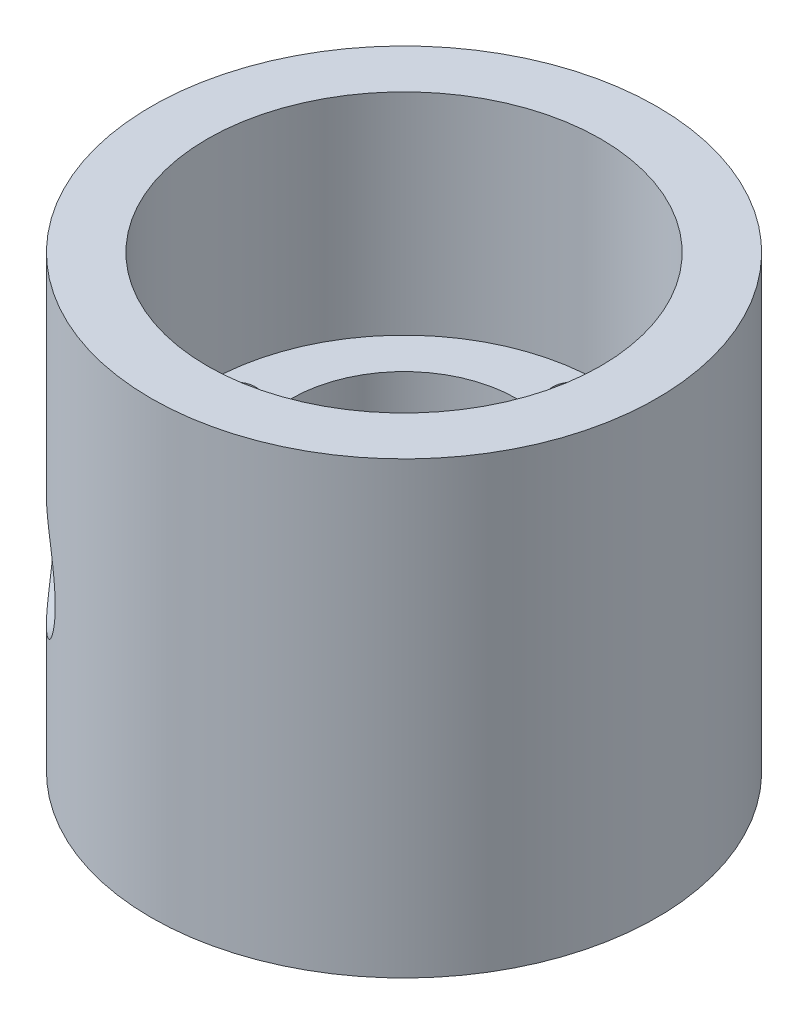
ISO-10303-21;
HEADER;
FILE_DESCRIPTION(('STEP AP214'),'2;1');
FILE_NAME('part.step','',(''),(''),'','','');
FILE_SCHEMA(('AUTOMOTIVE_DESIGN { 1 0 10303 214 1 1 1 1 }'));
ENDSEC;
DATA;
#1=APPLICATION_CONTEXT('core data for automotive mechanical design processes');
#2=APPLICATION_PROTOCOL_DEFINITION('international standard','automotive_design',2000,#1);
#3=PRODUCT_CONTEXT('',#1,'mechanical');
#4=PRODUCT('Part','Part','',(#3));
#5=PRODUCT_RELATED_PRODUCT_CATEGORY('part','',(#4));
#6=PRODUCT_DEFINITION_FORMATION('','',#4);
#7=PRODUCT_DEFINITION_CONTEXT('part definition',#1,'design');
#8=PRODUCT_DEFINITION('design','',#6,#7);
#9=PRODUCT_DEFINITION_SHAPE('','',#8);
#10=(LENGTH_UNIT() NAMED_UNIT(*) SI_UNIT(.MILLI.,.METRE.));
#11=(NAMED_UNIT(*) PLANE_ANGLE_UNIT() SI_UNIT($,.RADIAN.));
#12=(NAMED_UNIT(*) SI_UNIT($,.STERADIAN.) SOLID_ANGLE_UNIT());
#13=UNCERTAINTY_MEASURE_WITH_UNIT(LENGTH_MEASURE(1.E-05),#10,'distance_accuracy_value','');
#14=(GEOMETRIC_REPRESENTATION_CONTEXT(3) GLOBAL_UNCERTAINTY_ASSIGNED_CONTEXT((#13)) GLOBAL_UNIT_ASSIGNED_CONTEXT((#10,
#11,#12)) REPRESENTATION_CONTEXT('',''));
#15=CARTESIAN_POINT('',(0.,0.,0.));
#16=DIRECTION('',(0.,0.,1.));
#17=DIRECTION('',(1.,0.,0.));
#18=AXIS2_PLACEMENT_3D('',#15,#16,#17);
#19=CARTESIAN_POINT('',(1.5875,7.14375,1.5875));
#20=DIRECTION('',(0.,1.,0.));
#21=DIRECTION('',(0.,0.,1.));
#22=AXIS2_PLACEMENT_3D('',#19,#20,#21);
#23=CYLINDRICAL_SURFACE('',#22,6.35);
#24=CARTESIAN_POINT('',(1.5875,13.49375,1.5875));
#25=DIRECTION('',(0.,1.,0.));
#26=DIRECTION('',(0.,0.,1.));
#27=AXIS2_PLACEMENT_3D('',#24,#25,#26);
#28=CIRCLE('',#27,6.35);
#29=CARTESIAN_POINT('',(7.9375,13.49375,1.5875));
#30=VERTEX_POINT('',#29);
#31=CARTESIAN_POINT('',(1.5875,13.49375,7.9375));
#32=VERTEX_POINT('',#31);
#33=EDGE_CURVE('E102',#30,#32,#28,.F.);
#34=ORIENTED_EDGE('',*,*,#33,.F.);
#35=DIRECTION('',(0.,1.,0.));
#36=VECTOR('',#35,1.);
#37=CARTESIAN_POINT('',(7.9375,7.14375,1.5875));
#38=LINE('',#37,#36);
#39=CARTESIAN_POINT('',(7.9375,7.14375,1.5875));
#40=VERTEX_POINT('',#39);
#41=EDGE_CURVE('E109',#40,#30,#38,.T.);
#42=ORIENTED_EDGE('',*,*,#41,.F.);
#43=CARTESIAN_POINT('',(1.5875,7.14375,1.5875));
#44=DIRECTION('',(0.,1.,0.));
#45=DIRECTION('',(0.,0.,1.));
#46=AXIS2_PLACEMENT_3D('',#43,#44,#45);
#47=CIRCLE('',#46,6.35);
#48=CARTESIAN_POINT('',(1.5875,7.14375,7.9375));
#49=VERTEX_POINT('',#48);
#50=EDGE_CURVE('E112',#49,#40,#47,.T.);
#51=ORIENTED_EDGE('',*,*,#50,.F.);
#52=DIRECTION('',(0.,1.,0.));
#53=VECTOR('',#52,1.);
#54=CARTESIAN_POINT('',(1.5875,7.14375,7.9375));
#55=LINE('',#54,#53);
#56=EDGE_CURVE('E111',#49,#32,#55,.T.);
#57=ORIENTED_EDGE('',*,*,#56,.T.);
#58=EDGE_LOOP('',(#34,#42,#51,#57));
#59=FACE_BOUND('',#58,.T.);
#60=ADVANCED_FACE('F33',(#59),#23,.F.);
#61=CARTESIAN_POINT('',(-1.5875,7.14375,7.9375));
#62=DIRECTION('',(0.,0.,1.));
#63=DIRECTION('',(1.,0.,0.));
#64=AXIS2_PLACEMENT_3D('',#61,#62,#63);
#65=PLANE('',#64);
#66=DIRECTION('',(-1.,0.,0.));
#67=VECTOR('',#66,1.);
#68=CARTESIAN_POINT('',(-1.5875,13.49375,7.9375));
#69=LINE('',#68,#67);
#70=CARTESIAN_POINT('',(-1.5875,13.49375,7.9375));
#71=VERTEX_POINT('',#70);
#72=EDGE_CURVE('E113',#32,#71,#69,.T.);
#73=ORIENTED_EDGE('',*,*,#72,.F.);
#74=ORIENTED_EDGE('',*,*,#56,.F.);
#75=DIRECTION('',(1.,0.,0.));
#76=VECTOR('',#75,1.);
#77=CARTESIAN_POINT('',(-1.5875,7.14375,7.9375));
#78=LINE('',#77,#76);
#79=CARTESIAN_POINT('',(-1.5875,7.14375,7.9375));
#80=VERTEX_POINT('',#79);
#81=EDGE_CURVE('E120',#80,#49,#78,.T.);
#82=ORIENTED_EDGE('',*,*,#81,.F.);
#83=DIRECTION('',(0.,1.,0.));
#84=VECTOR('',#83,1.);
#85=CARTESIAN_POINT('',(-1.5875,7.14375,7.9375));
#86=LINE('',#85,#84);
#87=EDGE_CURVE('E214',#80,#71,#86,.T.);
#88=ORIENTED_EDGE('',*,*,#87,.T.);
#89=EDGE_LOOP('',(#73,#74,#82,#88));
#90=FACE_BOUND('',#89,.T.);
#91=ADVANCED_FACE('F158',(#90),#65,.F.);
#92=CARTESIAN_POINT('',(-1.5875,7.14375,1.5875));
#93=DIRECTION('',(0.,1.,0.));
#94=DIRECTION('',(0.,0.,1.));
#95=AXIS2_PLACEMENT_3D('',#92,#93,#94);
#96=CYLINDRICAL_SURFACE('',#95,6.35);
#97=CARTESIAN_POINT('',(-7.71348283393119,10.31875,3.25927579788091));
#98=CARTESIAN_POINT('',(-7.71348288630265,10.236548358768,3.25927723208728));
#99=CARTESIAN_POINT('',(-7.71250840108402,10.1543354461208,3.26286175721447));
#100=CARTESIAN_POINT('',(-7.70859263490347,9.99056091025765,3.27710620859846));
#101=CARTESIAN_POINT('',(-7.70565041848656,9.90899961549045,3.28776950006702));
#102=CARTESIAN_POINT('',(-7.69378214175024,9.66600471366821,3.33012635310995));
#103=CARTESIAN_POINT('',(-7.68181428556403,9.50640923927025,3.3721863292724));
#104=CARTESIAN_POINT('',(-7.64909475070211,9.19768423465855,3.4802959986888));
#105=CARTESIAN_POINT('',(-7.62838911216833,9.0485045568122,3.54621969663539));
#106=CARTESIAN_POINT('',(-7.57706767047033,8.76254132316634,3.6979460164086));
#107=CARTESIAN_POINT('',(-7.54645146794435,8.62575826719254,3.78374943928035));
#108=CARTESIAN_POINT('',(-7.47105353104531,8.35626305207354,3.97874859086851));
#109=CARTESIAN_POINT('',(-7.42532441198186,8.22478049162882,4.08927701558775));
#110=CARTESIAN_POINT('',(-7.31908326896584,7.98125636433913,4.32392934910468));
#111=CARTESIAN_POINT('',(-7.25856400578982,7.86922436388671,4.44805989917282));
#112=CARTESIAN_POINT('',(-7.11683757639493,7.66054334134762,4.71368315526549));
#113=CARTESIAN_POINT('',(-7.03452770270039,7.56539981283008,4.8557811216406));
#114=CARTESIAN_POINT('',(-6.85089760808282,7.40371734539538,5.14393790263186));
#115=CARTESIAN_POINT('',(-6.74958925350935,7.33716063622559,5.2899941964451));
#116=CARTESIAN_POINT('',(-6.53676723380618,7.23938776322082,5.56944676144378));
#117=CARTESIAN_POINT('',(-6.42646940270325,7.20601850675575,5.70301194048007));
#118=CARTESIAN_POINT('',(-6.19297094503589,7.16848366269772,5.96272104295744));
#119=CARTESIAN_POINT('',(-6.06977802741331,7.16430072700139,6.08886933070963));
#120=CARTESIAN_POINT('',(-5.82562125092652,7.18441122772869,6.31894443120551));
#121=CARTESIAN_POINT('',(-5.70536941091144,7.20629751961182,6.42384907316836));
#122=CARTESIAN_POINT('',(-5.46144291063261,7.27362648384906,6.62135537355313));
#123=CARTESIAN_POINT('',(-5.33776799522209,7.31907091666347,6.71395611187521));
#124=CARTESIAN_POINT('',(-5.08931690145904,7.43253937304063,6.88684216795603));
#125=CARTESIAN_POINT('',(-4.96454955515729,7.5008706889931,6.96693686044757));
#126=CARTESIAN_POINT('',(-4.71964088227218,7.65775491603314,7.11312801199449));
#127=CARTESIAN_POINT('',(-4.59950123839695,7.74631510304895,7.17921941781483));
#128=CARTESIAN_POINT('',(-4.35677647311003,7.95066296951351,7.30360864726293));
#129=CARTESIAN_POINT('',(-4.23501116476936,8.06822123029375,7.36060182144063));
#130=CARTESIAN_POINT('',(-4.00629443600086,8.32243953478651,7.46010758737054));
#131=CARTESIAN_POINT('',(-3.89935411578425,8.45911373938668,7.50260936306772));
#132=CARTESIAN_POINT('',(-3.69935216320274,8.75819486648312,7.57704799248509));
#133=CARTESIAN_POINT('',(-3.60755511683256,8.92166957389691,7.60817051309024));
#134=CARTESIAN_POINT('',(-3.49163756473933,9.17785056959237,7.64542073000237));
#135=CARTESIAN_POINT('',(-3.45662302968608,9.26509169529373,7.65626648342722));
#136=CARTESIAN_POINT('',(-3.39458116523898,9.44265558981677,7.67502911672624));
#137=CARTESIAN_POINT('',(-3.36754894927096,9.53297643537399,7.68294778923625));
#138=CARTESIAN_POINT('',(-3.32392135306818,9.70878809149197,7.69551237631457));
#139=CARTESIAN_POINT('',(-3.30667420522056,9.79410290353244,7.70036609595561));
#140=CARTESIAN_POINT('',(-3.27993896104936,9.96599931967349,7.70782218872443));
#141=CARTESIAN_POINT('',(-3.27044686114184,10.0525802466052,7.71042572356208));
#142=CARTESIAN_POINT('',(-3.25945350147406,10.2262619841196,7.71343722590599));
#143=CARTESIAN_POINT('',(-3.25794942539165,10.3133626006318,7.71384596722693));
#144=CARTESIAN_POINT('',(-3.26294978569848,10.4872891647341,7.71247879684957));
#145=CARTESIAN_POINT('',(-3.2694537018229,10.5741151298003,7.71070302707504));
#146=CARTESIAN_POINT('',(-3.29854748323687,10.814548624092,7.70266567609911));
#147=CARTESIAN_POINT('',(-3.32975354521154,10.9671155118767,7.69397798857677));
#148=CARTESIAN_POINT('',(-3.41497282834417,11.2649700782059,7.6690100982807));
#149=CARTESIAN_POINT('',(-3.4689932890754,11.4102554297538,7.65272748527773));
#150=CARTESIAN_POINT('',(-3.59944800016004,11.6972074671456,7.61074318044029));
#151=CARTESIAN_POINT('',(-3.67680570989392,11.8383936858082,7.58463960667301));
#152=CARTESIAN_POINT('',(-3.84876387574014,12.1072900059462,7.52193800375341));
#153=CARTESIAN_POINT('',(-3.94337316520988,12.2349931505207,7.48533459282221));
#154=CARTESIAN_POINT('',(-4.15849936697145,12.4898238638528,7.39505331544703));
#155=CARTESIAN_POINT('',(-4.28077323340074,12.6149279151827,7.33982387062913));
#156=CARTESIAN_POINT('',(-4.53697342987112,12.8429188473807,7.21275979658113));
#157=CARTESIAN_POINT('',(-4.67090347891483,12.9457986006744,7.14091985543189));
#158=CARTESIAN_POINT('',(-4.94853215707208,13.1285515667187,6.97753768879035));
#159=CARTESIAN_POINT('',(-5.09239071290376,13.207790597739,6.88555083338806));
#160=CARTESIAN_POINT('',(-5.38054801250668,13.3363065082814,6.68320164306115));
#161=CARTESIAN_POINT('',(-5.5248462670163,13.3856092830108,6.57285529489284));
#162=CARTESIAN_POINT('',(-5.79465381594438,13.4486665874728,6.34675309292175));
#163=CARTESIAN_POINT('',(-5.92067937069309,13.4652427372141,6.23239849723771));
#164=CARTESIAN_POINT('',(-6.16332958146822,13.4706577023946,5.99354396838973));
#165=CARTESIAN_POINT('',(-6.27995740827275,13.4595059139934,5.86904748583326));
#166=CARTESIAN_POINT('',(-6.49325020616646,13.411666704053,5.62247341274974));
#167=CARTESIAN_POINT('',(-6.59071599713175,13.3766641066732,5.50075339389313));
#168=CARTESIAN_POINT('',(-6.77273670137609,13.2843648144406,5.25616137850517));
#169=CARTESIAN_POINT('',(-6.85728973215191,13.2270648732531,5.13328921677333));
#170=CARTESIAN_POINT('',(-7.01627259218259,13.0892076593773,4.88501439562266));
#171=CARTESIAN_POINT('',(-7.09010719109283,13.0077524879937,4.75973177951349));
#172=CARTESIAN_POINT('',(-7.22349820625395,12.8250227428048,4.5162082984085));
#173=CARTESIAN_POINT('',(-7.28304802384489,12.7237390485663,4.3979707066475));
#174=CARTESIAN_POINT('',(-7.39406078802188,12.4927262325436,4.16141800881382));
#175=CARTESIAN_POINT('',(-7.44415704955877,12.3611812082196,4.0442334970912));
#176=CARTESIAN_POINT('',(-7.53013413106159,12.0792609394886,3.82829007223529));
#177=CARTESIAN_POINT('',(-7.56600273265578,11.9288696555684,3.72954703453217));
#178=CARTESIAN_POINT('',(-7.61086759017671,11.6893419277894,3.5984120156256));
#179=CARTESIAN_POINT('',(-7.62446188923158,11.6058497160231,3.5570586216698));
#180=CARTESIAN_POINT('',(-7.64856794567346,11.4352496935814,3.48157621047301));
#181=CARTESIAN_POINT('',(-7.65908129030392,11.3481437711128,3.44744347582876));
#182=CARTESIAN_POINT('',(-7.67720320233281,11.1711551356973,3.38722310521048));
#183=CARTESIAN_POINT('',(-7.68481927018009,11.0812802528883,3.36111472999745));
#184=CARTESIAN_POINT('',(-7.69734166371398,10.8993300696347,3.31748655115774));
#185=CARTESIAN_POINT('',(-7.70224989493588,10.8072563642514,3.29996070888379));
#186=CARTESIAN_POINT('',(-7.70841160098655,10.6490095626755,3.27777450006634));
#187=CARTESIAN_POINT('',(-7.71031507719968,10.5831710472184,3.27084737720551));
#188=CARTESIAN_POINT('',(-7.71285071441592,10.4511408064997,3.26159729711382));
#189=CARTESIAN_POINT('',(-7.71348279175514,10.3849490582812,3.25927464287829));
#190=CARTESIAN_POINT('',(-7.71348283393119,10.31875,3.25927579788091));
#191=B_SPLINE_CURVE_WITH_KNOTS('',3,(#97,#98,#99,#100,#101,#102,#103,#104,#105,#106,#107,#108,
#109,#110,#111,#112,#113,#114,#115,#116,#117,#118,#119,#120,#121,#122,#123,#124,#125,#126,#127,
#128,#129,#130,#131,#132,#133,#134,#135,#136,#137,#138,#139,#140,#141,#142,#143,#144,#145,#146,
#147,#148,#149,#150,#151,#152,#153,#154,#155,#156,#157,#158,#159,#160,#161,#162,#163,#164,#165,
#166,#167,#168,#169,#170,#171,#172,#173,#174,#175,#176,#177,#178,#179,#180,#181,#182,#183,#184,
#185,#186,#187,#188,#189,#190),.UNSPECIFIED.,.T.,.F.,(4,2,2,2,2,2,2,2,2,2,2,2,2,2,2,2,2,2,2,2,2,
2,2,2,2,2,2,2,2,2,2,2,2,2,2,2,2,2,2,2,2,2,2,2,2,2,4),(0.,0.246532390729438,0.49318206579272,
0.986922537538226,1.47809330559371,1.96928386861103,2.50030620890569,3.03158898721507,
3.5979752566787,4.16400893549226,4.69030312039166,5.21628445378896,5.69723767418854,
6.17822684059661,6.6659517792958,7.1538524200973,7.68732725723989,8.22119940086133,
8.78803434307085,9.07156989250368,9.35493150706886,9.61609243346521,9.87711844882429,
10.1380524286322,10.3989694569239,10.8645555473505,11.3302894909047,11.8176271579343,
12.3052150616399,12.8530909793784,13.4011423468796,13.9627921020401,14.5239553289718,
15.0341581194819,15.5441880412639,16.021484011911,16.498849499472,16.9968402379279,
17.4950605753274,18.0421633529092,18.589734957218,18.8718829713808,19.1538853722026,
19.4351526770686,19.7162217976527,19.9147474963899,20.1132862586032),.UNSPECIFIED.);
#192=CARTESIAN_POINT('',(-7.71348283393119,10.31875,3.25927579788091));
#193=VERTEX_POINT('',#192);
#194=EDGE_CURVE('E281',#193,#193,#191,.T.);
#195=ORIENTED_EDGE('',*,*,#194,.T.);
#196=EDGE_LOOP('',(#195));
#197=FACE_BOUND('',#196,.T.);
#198=CARTESIAN_POINT('',(-1.5875,13.49375,1.5875));
#199=DIRECTION('',(0.,1.,0.));
#200=DIRECTION('',(0.,0.,1.));
#201=AXIS2_PLACEMENT_3D('',#198,#199,#200);
#202=CIRCLE('',#201,6.35);
#203=CARTESIAN_POINT('',(-7.9375,13.49375,1.5875));
#204=VERTEX_POINT('',#203);
#205=EDGE_CURVE('E244',#71,#204,#202,.F.);
#206=ORIENTED_EDGE('',*,*,#205,.F.);
#207=ORIENTED_EDGE('',*,*,#87,.F.);
#208=CARTESIAN_POINT('',(-1.5875,7.14375,1.5875));
#209=DIRECTION('',(0.,1.,0.));
#210=DIRECTION('',(0.,0.,1.));
#211=AXIS2_PLACEMENT_3D('',#208,#209,#210);
#212=CIRCLE('',#211,6.35);
#213=CARTESIAN_POINT('',(-7.9375,7.14375,1.5875));
#214=VERTEX_POINT('',#213);
#215=EDGE_CURVE('E125',#214,#80,#212,.T.);
#216=ORIENTED_EDGE('',*,*,#215,.F.);
#217=DIRECTION('',(0.,1.,0.));
#218=VECTOR('',#217,1.);
#219=CARTESIAN_POINT('',(-7.9375,7.14375,1.5875));
#220=LINE('',#219,#218);
#221=EDGE_CURVE('E217',#214,#204,#220,.T.);
#222=ORIENTED_EDGE('',*,*,#221,.T.);
#223=EDGE_LOOP('',(#206,#207,#216,#222));
#224=FACE_BOUND('',#223,.T.);
#225=ADVANCED_FACE('F163',(#197,#224),#96,.F.);
#226=CARTESIAN_POINT('',(-7.9375,7.14375,-1.5875));
#227=DIRECTION('',(-1.,0.,0.));
#228=DIRECTION('',(0.,0.,1.));
#229=AXIS2_PLACEMENT_3D('',#226,#227,#228);
#230=PLANE('',#229);
#231=DIRECTION('',(0.,0.,-1.));
#232=VECTOR('',#231,1.);
#233=CARTESIAN_POINT('',(-7.9375,13.49375,-1.5875));
#234=LINE('',#233,#232);
#235=CARTESIAN_POINT('',(-7.9375,13.49375,-1.5875));
#236=VERTEX_POINT('',#235);
#237=EDGE_CURVE('E242',#204,#236,#234,.T.);
#238=ORIENTED_EDGE('',*,*,#237,.F.);
#239=ORIENTED_EDGE('',*,*,#221,.F.);
#240=DIRECTION('',(0.,0.,1.));
#241=VECTOR('',#240,1.);
#242=CARTESIAN_POINT('',(-7.9375,7.14375,-1.5875));
#243=LINE('',#242,#241);
#244=CARTESIAN_POINT('',(-7.9375,7.14375,-1.5875));
#245=VERTEX_POINT('',#244);
#246=EDGE_CURVE('E209',#245,#214,#243,.T.);
#247=ORIENTED_EDGE('',*,*,#246,.F.);
#248=DIRECTION('',(0.,1.,0.));
#249=VECTOR('',#248,1.);
#250=CARTESIAN_POINT('',(-7.9375,7.14375,-1.5875));
#251=LINE('',#250,#249);
#252=EDGE_CURVE('E220',#245,#236,#251,.T.);
#253=ORIENTED_EDGE('',*,*,#252,.T.);
#254=EDGE_LOOP('',(#238,#239,#247,#253));
#255=FACE_BOUND('',#254,.T.);
#256=ADVANCED_FACE('F252',(#255),#230,.F.);
#257=CARTESIAN_POINT('',(-1.5875,7.14375,-1.5875));
#258=DIRECTION('',(0.,1.,0.));
#259=DIRECTION('',(0.,0.,1.));
#260=AXIS2_PLACEMENT_3D('',#257,#258,#259);
#261=CYLINDRICAL_SURFACE('',#260,6.35);
#262=CARTESIAN_POINT('',(-1.5875,13.49375,-1.5875));
#263=DIRECTION('',(0.,1.,0.));
#264=DIRECTION('',(0.,0.,1.));
#265=AXIS2_PLACEMENT_3D('',#262,#263,#264);
#266=CIRCLE('',#265,6.35);
#267=CARTESIAN_POINT('',(-1.5875,13.49375,-7.9375));
#268=VERTEX_POINT('',#267);
#269=EDGE_CURVE('E234',#236,#268,#266,.F.);
#270=ORIENTED_EDGE('',*,*,#269,.F.);
#271=ORIENTED_EDGE('',*,*,#252,.F.);
#272=CARTESIAN_POINT('',(-1.5875,7.14375,-1.5875));
#273=DIRECTION('',(0.,1.,0.));
#274=DIRECTION('',(0.,0.,1.));
#275=AXIS2_PLACEMENT_3D('',#272,#273,#274);
#276=CIRCLE('',#275,6.35);
#277=CARTESIAN_POINT('',(-1.5875,7.14375,-7.9375));
#278=VERTEX_POINT('',#277);
#279=EDGE_CURVE('E206',#278,#245,#276,.T.);
#280=ORIENTED_EDGE('',*,*,#279,.F.);
#281=DIRECTION('',(0.,1.,0.));
#282=VECTOR('',#281,1.);
#283=CARTESIAN_POINT('',(-1.5875,7.14375,-7.9375));
#284=LINE('',#283,#282);
#285=EDGE_CURVE('E223',#278,#268,#284,.T.);
#286=ORIENTED_EDGE('',*,*,#285,.T.);
#287=EDGE_LOOP('',(#270,#271,#280,#286));
#288=FACE_BOUND('',#287,.T.);
#289=ADVANCED_FACE('F255',(#288),#261,.F.);
#290=CARTESIAN_POINT('',(-1.5875,7.14375,-7.9375));
#291=DIRECTION('',(0.,0.,-1.));
#292=DIRECTION('',(-1.,0.,0.));
#293=AXIS2_PLACEMENT_3D('',#290,#291,#292);
#294=PLANE('',#293);
#295=DIRECTION('',(1.,0.,0.));
#296=VECTOR('',#295,1.);
#297=CARTESIAN_POINT('',(-1.5875,13.49375,-7.9375));
#298=LINE('',#297,#296);
#299=CARTESIAN_POINT('',(1.5875,13.49375,-7.9375));
#300=VERTEX_POINT('',#299);
#301=EDGE_CURVE('E230',#268,#300,#298,.T.);
#302=ORIENTED_EDGE('',*,*,#301,.F.);
#303=ORIENTED_EDGE('',*,*,#285,.F.);
#304=DIRECTION('',(-1.,0.,0.));
#305=VECTOR('',#304,1.);
#306=CARTESIAN_POINT('',(-1.5875,7.14375,-7.9375));
#307=LINE('',#306,#305);
#308=CARTESIAN_POINT('',(1.5875,7.14375,-7.9375));
#309=VERTEX_POINT('',#308);
#310=EDGE_CURVE('E203',#309,#278,#307,.T.);
#311=ORIENTED_EDGE('',*,*,#310,.F.);
#312=DIRECTION('',(0.,1.,0.));
#313=VECTOR('',#312,1.);
#314=CARTESIAN_POINT('',(1.5875,7.14375,-7.9375));
#315=LINE('',#314,#313);
#316=EDGE_CURVE('E122',#309,#300,#315,.T.);
#317=ORIENTED_EDGE('',*,*,#316,.T.);
#318=EDGE_LOOP('',(#302,#303,#311,#317));
#319=FACE_BOUND('',#318,.T.);
#320=ADVANCED_FACE('F229',(#319),#294,.F.);
#321=CARTESIAN_POINT('',(1.5875,7.14375,-1.5875));
#322=DIRECTION('',(0.,1.,0.));
#323=DIRECTION('',(0.,0.,1.));
#324=AXIS2_PLACEMENT_3D('',#321,#322,#323);
#325=CYLINDRICAL_SURFACE('',#324,6.35);
#326=CARTESIAN_POINT('',(1.5875,13.49375,-1.5875));
#327=DIRECTION('',(0.,1.,0.));
#328=DIRECTION('',(0.,0.,1.));
#329=AXIS2_PLACEMENT_3D('',#326,#327,#328);
#330=CIRCLE('',#329,6.35);
#331=CARTESIAN_POINT('',(7.9375,13.49375,-1.5875));
#332=VERTEX_POINT('',#331);
#333=EDGE_CURVE('E52',#300,#332,#330,.F.);
#334=ORIENTED_EDGE('',*,*,#333,.F.);
#335=ORIENTED_EDGE('',*,*,#316,.F.);
#336=CARTESIAN_POINT('',(1.5875,7.14375,-1.5875));
#337=DIRECTION('',(0.,1.,0.));
#338=DIRECTION('',(0.,0.,-1.));
#339=AXIS2_PLACEMENT_3D('',#336,#337,#338);
#340=CIRCLE('',#339,6.35);
#341=CARTESIAN_POINT('',(7.9375,7.14375,-1.5875));
#342=VERTEX_POINT('',#341);
#343=EDGE_CURVE('E60',#342,#309,#340,.T.);
#344=ORIENTED_EDGE('',*,*,#343,.F.);
#345=DIRECTION('',(0.,1.,0.));
#346=VECTOR('',#345,1.);
#347=CARTESIAN_POINT('',(7.9375,7.14375,-1.5875));
#348=LINE('',#347,#346);
#349=EDGE_CURVE('E119',#342,#332,#348,.T.);
#350=ORIENTED_EDGE('',*,*,#349,.T.);
#351=EDGE_LOOP('',(#334,#335,#344,#350));
#352=FACE_BOUND('',#351,.T.);
#353=ADVANCED_FACE('F231',(#352),#325,.F.);
#354=CARTESIAN_POINT('',(7.9375,7.14375,-1.5875));
#355=DIRECTION('',(1.,0.,0.));
#356=DIRECTION('',(0.,0.,-1.));
#357=AXIS2_PLACEMENT_3D('',#354,#355,#356);
#358=PLANE('',#357);
#359=DIRECTION('',(0.,0.,1.));
#360=VECTOR('',#359,1.);
#361=CARTESIAN_POINT('',(7.9375,13.49375,-1.5875));
#362=LINE('',#361,#360);
#363=EDGE_CURVE('E11',#332,#30,#362,.T.);
#364=ORIENTED_EDGE('',*,*,#363,.F.);
#365=ORIENTED_EDGE('',*,*,#349,.F.);
#366=DIRECTION('',(0.,0.,-1.));
#367=VECTOR('',#366,1.);
#368=CARTESIAN_POINT('',(7.9375,7.14375,-1.5875));
#369=LINE('',#368,#367);
#370=EDGE_CURVE('E117',#40,#342,#369,.T.);
#371=ORIENTED_EDGE('',*,*,#370,.F.);
#372=ORIENTED_EDGE('',*,*,#41,.T.);
#373=EDGE_LOOP('',(#364,#365,#371,#372));
#374=FACE_BOUND('',#373,.T.);
#375=ADVANCED_FACE('F115',(#374),#358,.F.);
#376=CARTESIAN_POINT('',(0.,25.4,0.));
#377=DIRECTION('',(0.,-1.,0.));
#378=DIRECTION('',(0.,0.,-1.));
#379=AXIS2_PLACEMENT_3D('',#376,#377,#378);
#380=CYLINDRICAL_SURFACE('',#379,14.2875);
#381=CARTESIAN_POINT('',(-12.0813583373912,10.31875,7.62715130134097));
#382=CARTESIAN_POINT('',(-12.0813566197071,10.4933424370408,7.62715800885917));
#383=CARTESIAN_POINT('',(-12.0734033938072,10.6680061680274,7.63979679336695));
#384=CARTESIAN_POINT('',(-12.0416379576883,11.012364002568,7.68976306885876));
#385=CARTESIAN_POINT('',(-12.0178143984774,11.1820544589731,7.7271082274204));
#386=CARTESIAN_POINT('',(-11.9545175167599,11.5114346923799,7.82467390842753));
#387=CARTESIAN_POINT('',(-11.9150615197321,11.6711353150208,7.88486910302403));
#388=CARTESIAN_POINT('',(-11.8208021626987,11.9764524845297,8.02548602357539));
#389=CARTESIAN_POINT('',(-11.7659990677805,12.1220692746064,8.10590740016522));
#390=CARTESIAN_POINT('',(-11.6405304714575,12.3975855654056,8.28509628287981));
#391=CARTESIAN_POINT('',(-11.5696335094115,12.5272082335399,8.38412744447022));
#392=CARTESIAN_POINT('',(-11.4131974805812,12.764631514907,8.5958638597558));
#393=CARTESIAN_POINT('',(-11.3276572654427,12.8724304152264,8.70857018568363));
#394=CARTESIAN_POINT('',(-11.1420795722571,13.0642431353859,8.94480210498677));
#395=CARTESIAN_POINT('',(-11.0418969057595,13.1479903987718,9.06843046866736));
#396=CARTESIAN_POINT('',(-10.8295249608238,13.2875975914365,9.32101026643035));
#397=CARTESIAN_POINT('',(-10.7173370530754,13.3434607002516,9.44996109179404));
#398=CARTESIAN_POINT('',(-10.4853546677015,13.4248423256269,9.70666953179441));
#399=CARTESIAN_POINT('',(-10.3657095959771,13.4508294520803,9.83441349260067));
#400=CARTESIAN_POINT('',(-10.1204096311957,13.4731868819227,10.0866694100398));
#401=CARTESIAN_POINT('',(-9.99475543774934,13.4695606247382,10.2111817403232));
#402=CARTESIAN_POINT('',(-9.74338901260402,13.4331426161731,10.4512548802248));
#403=CARTESIAN_POINT('',(-9.61771531532281,13.4008560030379,10.5669332049519));
#404=CARTESIAN_POINT('',(-9.36810103828658,13.3088390945373,10.7888482696791));
#405=CARTESIAN_POINT('',(-9.2441605379673,13.2491075455377,10.8950845781207));
#406=CARTESIAN_POINT('',(-9.00116014198116,13.1034515058736,11.0967070730002));
#407=CARTESIAN_POINT('',(-8.88214323143605,13.0173361506163,11.1920069999743));
#408=CARTESIAN_POINT('',(-8.6540335519124,12.8214994427417,11.3693123062735));
#409=CARTESIAN_POINT('',(-8.54494215772786,12.7117748270412,11.4513158451282));
#410=CARTESIAN_POINT('',(-8.33842187610492,12.4690863077678,11.6025916816657));
#411=CARTESIAN_POINT('',(-8.24128814464721,12.3356803241991,11.6715583352065));
#412=CARTESIAN_POINT('',(-8.06528309549122,12.0508593176364,11.7938706914719));
#413=CARTESIAN_POINT('',(-7.98641228874551,11.8994437909584,11.8472159571588));
#414=CARTESIAN_POINT('',(-7.85010410524483,11.582207469647,11.9379763642483));
#415=CARTESIAN_POINT('',(-7.79273280377548,11.416344166174,11.9753424450561));
#416=CARTESIAN_POINT('',(-7.7024640681014,11.0753285860637,12.0336037828544));
#417=CARTESIAN_POINT('',(-7.66956268379549,10.9001778135656,12.0545016982811));
#418=CARTESIAN_POINT('',(-7.63027644700511,10.5494440441485,12.079406969336));
#419=CARTESIAN_POINT('',(-7.62335677815171,10.3739450513724,12.0837550190674));
#420=CARTESIAN_POINT('',(-7.63489166861825,10.0241264183578,12.0764701317213));
#421=CARTESIAN_POINT('',(-7.65334445508417,9.8498066965753,12.0648383112083));
#422=CARTESIAN_POINT('',(-7.71434123045058,9.50945784690941,12.0259246995471));
#423=CARTESIAN_POINT('',(-7.75659201137229,9.34335409077647,11.9988333285849));
#424=CARTESIAN_POINT('',(-7.86303791245542,9.02171977245236,11.9293464198966));
#425=CARTESIAN_POINT('',(-7.9272351602346,8.86619023714074,11.8869493983297));
#426=CARTESIAN_POINT('',(-8.07600763993611,8.56744308829701,11.7863867814134));
#427=CARTESIAN_POINT('',(-8.16088546073852,8.4244556850683,11.7279852661176));
#428=CARTESIAN_POINT('',(-8.34705461147866,8.15728461324792,11.5962197487225));
#429=CARTESIAN_POINT('',(-8.44834801331193,8.03310332210546,11.5228538575891));
#430=CARTESIAN_POINT('',(-8.66559880151336,7.80466117520755,11.3604032215735));
#431=CARTESIAN_POINT('',(-8.78179783285769,7.70082271766466,11.2710467863152));
#432=CARTESIAN_POINT('',(-9.02300778558513,7.51903688495132,11.0788865894445));
#433=CARTESIAN_POINT('',(-9.14801829168432,7.44108829058198,10.9760834613783));
#434=CARTESIAN_POINT('',(-9.40158822371498,7.31388041142128,10.7596641594187));
#435=CARTESIAN_POINT('',(-9.5301192704154,7.2644377813633,10.6461226831565));
#436=CARTESIAN_POINT('',(-9.7871444466327,7.1950737171528,10.4103240136954));
#437=CARTESIAN_POINT('',(-9.91563857879817,7.17514792008699,10.2880681113853));
#438=CARTESIAN_POINT('',(-10.1658261331192,7.16558188967815,10.0408623475054));
#439=CARTESIAN_POINT('',(-10.2876058482045,7.17531139907447,9.9160237855068));
#440=CARTESIAN_POINT('',(-10.5238420390144,7.22336829425209,9.66494304043233));
#441=CARTESIAN_POINT('',(-10.638298650394,7.26169515012198,9.53870088340789));
#442=CARTESIAN_POINT('',(-10.8567911516901,7.36555474830927,9.28925013444244));
#443=CARTESIAN_POINT('',(-10.9608603544064,7.43099680832427,9.16603286764966));
#444=CARTESIAN_POINT('',(-11.1570083438751,7.5871412303534,8.92624474627577));
#445=CARTESIAN_POINT('',(-11.2490859457264,7.67784608583223,8.80967454913644));
#446=CARTESIAN_POINT('',(-11.4215010319586,7.88398953678884,8.58501197751009));
#447=CARTESIAN_POINT('',(-11.5015784548742,7.99987056669762,8.47712594989415));
#448=CARTESIAN_POINT('',(-11.6468807027306,8.25218620160605,8.27636513844525));
#449=CARTESIAN_POINT('',(-11.7121019353632,8.38862576454816,8.18349398686389));
#450=CARTESIAN_POINT('',(-11.8278421127288,8.68042205595558,8.01532269599062));
#451=CARTESIAN_POINT('',(-11.8781485554853,8.83601127179144,7.94027929460878));
#452=CARTESIAN_POINT('',(-11.9623966667805,9.16023046125933,7.81278480173146));
#453=CARTESIAN_POINT('',(-11.9963520893412,9.32884933564747,7.76031472615891));
#454=CARTESIAN_POINT('',(-12.0417679769716,9.63447330380462,7.68958964003982));
#455=CARTESIAN_POINT('',(-12.0566060485127,9.76982957451169,7.66624081965815));
#456=CARTESIAN_POINT('',(-12.0764016586006,10.0430258248466,7.63501939074357));
#457=CARTESIAN_POINT('',(-12.0813596939318,10.180865679244,7.62714600408064));
#458=CARTESIAN_POINT('',(-12.0813583373912,10.31875,7.62715130134097));
#459=B_SPLINE_CURVE_WITH_KNOTS('',3,(#381,#382,#383,#384,#385,#386,#387,#388,#389,#390,#391,
#392,#393,#394,#395,#396,#397,#398,#399,#400,#401,#402,#403,#404,#405,#406,#407,#408,#409,#410,
#411,#412,#413,#414,#415,#416,#417,#418,#419,#420,#421,#422,#423,#424,#425,#426,#427,#428,#429,
#430,#431,#432,#433,#434,#435,#436,#437,#438,#439,#440,#441,#442,#443,#444,#445,#446,#447,#448,
#449,#450,#451,#452,#453,#454,#455,#456,#457,#458),.UNSPECIFIED.,.T.,.F.,(4,2,2,2,2,2,2,2,2,2,2,
2,2,2,2,2,2,2,2,2,2,2,2,2,2,2,2,2,2,2,2,2,2,2,2,2,2,2,4),(0.,0.523271925339135,1.04691844853961,
1.56998622891387,2.0930449750055,2.62416534597816,3.15532738760663,3.69216704463796,
4.22894547365866,4.75718436004055,5.28536189534586,5.80441115760489,6.3234841314356,
6.84640455671533,7.36939730235213,7.90344154116422,8.43750071944048,8.97318803804982,
9.5087888635726,10.0333022819871,10.5577790528458,11.0759309707752,11.594133135608,
12.1204281486218,12.6467896398647,13.1831323526546,13.7194498045471,14.2522781295605,
14.7850276888127,15.3065343682111,15.8280313842837,16.347798239883,16.8676164152134,
17.3974391756367,17.9273899144282,18.4645636629283,19.0012847631081,19.4145593777693,
19.827813211778),.UNSPECIFIED.);
#460=CARTESIAN_POINT('',(-12.0813583373912,10.31875,7.62715130134097));
#461=VERTEX_POINT('',#460);
#462=EDGE_CURVE('E38',#461,#461,#459,.T.);
#463=ORIENTED_EDGE('',*,*,#462,.T.);
#464=EDGE_LOOP('',(#463));
#465=FACE_BOUND('',#464,.T.);
#466=CARTESIAN_POINT('',(0.,25.4,0.));
#467=DIRECTION('',(0.,1.,0.));
#468=DIRECTION('',(0.,0.,1.));
#469=AXIS2_PLACEMENT_3D('',#466,#467,#468);
#470=CIRCLE('',#469,14.2875);
#471=CARTESIAN_POINT('',(0.,25.4,14.2875));
#472=VERTEX_POINT('',#471);
#473=EDGE_CURVE('E46',#472,#472,#470,.T.);
#474=ORIENTED_EDGE('',*,*,#473,.F.);
#475=EDGE_LOOP('',(#474));
#476=FACE_BOUND('',#475,.T.);
#477=CARTESIAN_POINT('',(0.,0.,0.));
#478=DIRECTION('',(0.,1.,0.));
#479=DIRECTION('',(0.,0.,1.));
#480=AXIS2_PLACEMENT_3D('',#477,#478,#479);
#481=CIRCLE('',#480,14.2875);
#482=CARTESIAN_POINT('',(0.,0.,14.2875));
#483=VERTEX_POINT('',#482);
#484=EDGE_CURVE('E132',#483,#483,#481,.T.);
#485=ORIENTED_EDGE('',*,*,#484,.T.);
#486=EDGE_LOOP('',(#485));
#487=FACE_BOUND('',#486,.T.);
#488=ADVANCED_FACE('F35',(#465,#476,#487),#380,.T.);
#489=CARTESIAN_POINT('',(0.,25.4,0.));
#490=DIRECTION('',(0.,1.,0.));
#491=DIRECTION('',(0.,0.,1.));
#492=AXIS2_PLACEMENT_3D('',#489,#490,#491);
#493=PLANE('',#492);
#494=CARTESIAN_POINT('',(0.,25.4,0.));
#495=DIRECTION('',(0.,1.,0.));
#496=DIRECTION('',(0.,0.,1.));
#497=AXIS2_PLACEMENT_3D('',#494,#495,#496);
#498=CIRCLE('',#497,11.1125);
#499=CARTESIAN_POINT('',(0.,25.4,11.1125));
#500=VERTEX_POINT('',#499);
#501=EDGE_CURVE('E237',#500,#500,#498,.T.);
#502=ORIENTED_EDGE('',*,*,#501,.F.);
#503=EDGE_LOOP('',(#502));
#504=FACE_BOUND('',#503,.T.);
#505=ORIENTED_EDGE('',*,*,#473,.T.);
#506=EDGE_LOOP('',(#505));
#507=FACE_BOUND('',#506,.T.);
#508=ADVANCED_FACE('F145',(#504,#507),#493,.T.);
#509=CARTESIAN_POINT('',(0.,0.,0.));
#510=DIRECTION('',(0.,1.,0.));
#511=DIRECTION('',(0.,0.,1.));
#512=AXIS2_PLACEMENT_3D('',#509,#510,#511);
#513=PLANE('',#512);
#514=CARTESIAN_POINT('',(0.,0.,0.));
#515=DIRECTION('',(0.,-1.,0.));
#516=DIRECTION('',(0.,0.,-1.));
#517=AXIS2_PLACEMENT_3D('',#514,#515,#516);
#518=CIRCLE('',#517,11.1125);
#519=CARTESIAN_POINT('',(0.,0.,-11.1125));
#520=VERTEX_POINT('',#519);
#521=EDGE_CURVE('E133',#520,#520,#518,.T.);
#522=ORIENTED_EDGE('',*,*,#521,.F.);
#523=EDGE_LOOP('',(#522));
#524=FACE_BOUND('',#523,.T.);
#525=ORIENTED_EDGE('',*,*,#484,.F.);
#526=EDGE_LOOP('',(#525));
#527=FACE_BOUND('',#526,.T.);
#528=ADVANCED_FACE('F142',(#524,#527),#513,.F.);
#529=CARTESIAN_POINT('',(0.,7.14375,0.));
#530=DIRECTION('',(0.,-1.,0.));
#531=DIRECTION('',(0.,0.,-1.));
#532=AXIS2_PLACEMENT_3D('',#529,#530,#531);
#533=CYLINDRICAL_SURFACE('',#532,11.1125);
#534=CARTESIAN_POINT('',(0.,7.14375,0.));
#535=DIRECTION('',(0.,-1.,0.));
#536=DIRECTION('',(0.,0.,-1.));
#537=AXIS2_PLACEMENT_3D('',#534,#535,#536);
#538=CIRCLE('',#537,11.1125);
#539=CARTESIAN_POINT('',(0.,7.14375,-11.1125));
#540=VERTEX_POINT('',#539);
#541=EDGE_CURVE('E129',#540,#540,#538,.T.);
#542=ORIENTED_EDGE('',*,*,#541,.F.);
#543=EDGE_LOOP('',(#542));
#544=FACE_BOUND('',#543,.T.);
#545=ORIENTED_EDGE('',*,*,#521,.T.);
#546=EDGE_LOOP('',(#545));
#547=FACE_BOUND('',#546,.T.);
#548=ADVANCED_FACE('F144',(#544,#547),#533,.F.);
#549=CARTESIAN_POINT('',(0.,7.14375,0.));
#550=DIRECTION('',(0.,-1.,0.));
#551=DIRECTION('',(0.,0.,-1.));
#552=AXIS2_PLACEMENT_3D('',#549,#550,#551);
#553=PLANE('',#552);
#554=CARTESIAN_POINT('',(9.525,7.14375,0.));
#555=DIRECTION('',(0.,-1.,0.));
#556=DIRECTION('',(0.,0.,-1.));
#557=AXIS2_PLACEMENT_3D('',#554,#555,#556);
#558=CIRCLE('',#557,1.13029999999999);
#559=CARTESIAN_POINT('',(9.525,7.14375,-1.13030000000009));
#560=VERTEX_POINT('',#559);
#561=EDGE_CURVE('E180',#560,#560,#558,.T.);
#562=ORIENTED_EDGE('',*,*,#561,.F.);
#563=EDGE_LOOP('',(#562));
#564=FACE_BOUND('',#563,.T.);
#565=CARTESIAN_POINT('',(0.,7.14375,9.525));
#566=DIRECTION('',(0.,-1.,0.));
#567=DIRECTION('',(0.,0.,-1.));
#568=AXIS2_PLACEMENT_3D('',#565,#566,#567);
#569=CIRCLE('',#568,1.13029999999999);
#570=CARTESIAN_POINT('',(0.,7.14375,8.39470000000001));
#571=VERTEX_POINT('',#570);
#572=EDGE_CURVE('E184',#571,#571,#569,.T.);
#573=ORIENTED_EDGE('',*,*,#572,.F.);
#574=EDGE_LOOP('',(#573));
#575=FACE_BOUND('',#574,.T.);
#576=CARTESIAN_POINT('',(-9.525,7.14375,0.));
#577=DIRECTION('',(0.,-1.,0.));
#578=DIRECTION('',(0.,0.,-1.));
#579=AXIS2_PLACEMENT_3D('',#576,#577,#578);
#580=CIRCLE('',#579,1.13029999999999);
#581=CARTESIAN_POINT('',(-9.525,7.14375,-1.13029999999996));
#582=VERTEX_POINT('',#581);
#583=EDGE_CURVE('E188',#582,#582,#580,.T.);
#584=ORIENTED_EDGE('',*,*,#583,.F.);
#585=EDGE_LOOP('',(#584));
#586=FACE_BOUND('',#585,.T.);
#587=CARTESIAN_POINT('',(0.,7.14375,-9.525));
#588=DIRECTION('',(0.,-1.,0.));
#589=DIRECTION('',(0.,0.,-1.));
#590=AXIS2_PLACEMENT_3D('',#587,#588,#589);
#591=CIRCLE('',#590,1.13029999999999);
#592=CARTESIAN_POINT('',(0.,7.14375,-10.6553));
#593=VERTEX_POINT('',#592);
#594=EDGE_CURVE('E192',#593,#593,#591,.T.);
#595=ORIENTED_EDGE('',*,*,#594,.F.);
#596=EDGE_LOOP('',(#595));
#597=FACE_BOUND('',#596,.T.);
#598=ORIENTED_EDGE('',*,*,#50,.T.);
#599=ORIENTED_EDGE('',*,*,#370,.T.);
#600=ORIENTED_EDGE('',*,*,#343,.T.);
#601=ORIENTED_EDGE('',*,*,#310,.T.);
#602=ORIENTED_EDGE('',*,*,#279,.T.);
#603=ORIENTED_EDGE('',*,*,#246,.T.);
#604=ORIENTED_EDGE('',*,*,#215,.T.);
#605=ORIENTED_EDGE('',*,*,#81,.T.);
#606=EDGE_LOOP('',(#598,#599,#600,#601,#602,#603,#604,#605));
#607=FACE_BOUND('',#606,.T.);
#608=ORIENTED_EDGE('',*,*,#541,.T.);
#609=EDGE_LOOP('',(#608));
#610=FACE_BOUND('',#609,.T.);
#611=ADVANCED_FACE('F151',(#564,#575,#586,#597,#607,#610),#553,.T.);
#612=CARTESIAN_POINT('',(0.,13.49375,0.));
#613=DIRECTION('',(0.,1.,0.));
#614=DIRECTION('',(0.,0.,1.));
#615=AXIS2_PLACEMENT_3D('',#612,#613,#614);
#616=PLANE('',#615);
#617=CARTESIAN_POINT('',(9.525,13.49375,0.));
#618=DIRECTION('',(0.,1.,0.));
#619=DIRECTION('',(0.,0.,1.));
#620=AXIS2_PLACEMENT_3D('',#617,#618,#619);
#621=CIRCLE('',#620,1.13029999999999);
#622=CARTESIAN_POINT('',(9.525,13.49375,1.13029999999989));
#623=VERTEX_POINT('',#622);
#624=EDGE_CURVE('E283',#623,#623,#621,.T.);
#625=ORIENTED_EDGE('',*,*,#624,.F.);
#626=EDGE_LOOP('',(#625));
#627=FACE_BOUND('',#626,.T.);
#628=CARTESIAN_POINT('',(0.,13.49375,9.525));
#629=DIRECTION('',(0.,1.,0.));
#630=DIRECTION('',(0.,0.,1.));
#631=AXIS2_PLACEMENT_3D('',#628,#629,#630);
#632=CIRCLE('',#631,1.13029999999999);
#633=CARTESIAN_POINT('',(0.,13.49375,10.6553));
#634=VERTEX_POINT('',#633);
#635=EDGE_CURVE('E332',#634,#634,#632,.T.);
#636=ORIENTED_EDGE('',*,*,#635,.F.);
#637=EDGE_LOOP('',(#636));
#638=FACE_BOUND('',#637,.T.);
#639=CARTESIAN_POINT('',(-9.525,13.49375,0.));
#640=DIRECTION('',(0.,1.,0.));
#641=DIRECTION('',(0.,0.,1.));
#642=AXIS2_PLACEMENT_3D('',#639,#640,#641);
#643=CIRCLE('',#642,1.13029999999999);
#644=CARTESIAN_POINT('',(-9.525,13.49375,1.13030000000002));
#645=VERTEX_POINT('',#644);
#646=EDGE_CURVE('E328',#645,#645,#643,.T.);
#647=ORIENTED_EDGE('',*,*,#646,.F.);
#648=EDGE_LOOP('',(#647));
#649=FACE_BOUND('',#648,.T.);
#650=CARTESIAN_POINT('',(0.,13.49375,-9.525));
#651=DIRECTION('',(0.,1.,0.));
#652=DIRECTION('',(0.,0.,1.));
#653=AXIS2_PLACEMENT_3D('',#650,#651,#652);
#654=CIRCLE('',#653,1.13029999999999);
#655=CARTESIAN_POINT('',(0.,13.49375,-8.39470000000001));
#656=VERTEX_POINT('',#655);
#657=EDGE_CURVE('E322',#656,#656,#654,.T.);
#658=ORIENTED_EDGE('',*,*,#657,.F.);
#659=EDGE_LOOP('',(#658));
#660=FACE_BOUND('',#659,.T.);
#661=CARTESIAN_POINT('',(0.,13.49375,0.));
#662=DIRECTION('',(0.,1.,0.));
#663=DIRECTION('',(0.,0.,1.));
#664=AXIS2_PLACEMENT_3D('',#661,#662,#663);
#665=CIRCLE('',#664,11.1125);
#666=CARTESIAN_POINT('',(0.,13.49375,11.1125));
#667=VERTEX_POINT('',#666);
#668=EDGE_CURVE('E232',#667,#667,#665,.T.);
#669=ORIENTED_EDGE('',*,*,#668,.T.);
#670=EDGE_LOOP('',(#669));
#671=FACE_BOUND('',#670,.T.);
#672=ORIENTED_EDGE('',*,*,#33,.T.);
#673=ORIENTED_EDGE('',*,*,#72,.T.);
#674=ORIENTED_EDGE('',*,*,#205,.T.);
#675=ORIENTED_EDGE('',*,*,#237,.T.);
#676=ORIENTED_EDGE('',*,*,#269,.T.);
#677=ORIENTED_EDGE('',*,*,#301,.T.);
#678=ORIENTED_EDGE('',*,*,#333,.T.);
#679=ORIENTED_EDGE('',*,*,#363,.T.);
#680=EDGE_LOOP('',(#672,#673,#674,#675,#676,#677,#678,#679));
#681=FACE_BOUND('',#680,.T.);
#682=ADVANCED_FACE('F101',(#627,#638,#649,#660,#671,#681),#616,.T.);
#683=CARTESIAN_POINT('',(0.,13.49375,0.));
#684=DIRECTION('',(0.,1.,0.));
#685=DIRECTION('',(0.,0.,1.));
#686=AXIS2_PLACEMENT_3D('',#683,#684,#685);
#687=CYLINDRICAL_SURFACE('',#686,11.1125);
#688=ORIENTED_EDGE('',*,*,#668,.F.);
#689=EDGE_LOOP('',(#688));
#690=FACE_BOUND('',#689,.T.);
#691=ORIENTED_EDGE('',*,*,#501,.T.);
#692=EDGE_LOOP('',(#691));
#693=FACE_BOUND('',#692,.T.);
#694=ADVANCED_FACE('F174',(#690,#693),#687,.F.);
#695=CARTESIAN_POINT('',(0.,13.49375,-9.525));
#696=DIRECTION('',(0.,1.,0.));
#697=DIRECTION('',(0.,0.,1.));
#698=AXIS2_PLACEMENT_3D('',#695,#696,#697);
#699=CYLINDRICAL_SURFACE('',#698,1.13029999999999);
#700=ORIENTED_EDGE('',*,*,#594,.T.);
#701=EDGE_LOOP('',(#700));
#702=FACE_BOUND('',#701,.T.);
#703=ORIENTED_EDGE('',*,*,#657,.T.);
#704=EDGE_LOOP('',(#703));
#705=FACE_BOUND('',#704,.T.);
#706=ADVANCED_FACE('F309',(#702,#705),#699,.F.);
#707=CARTESIAN_POINT('',(-9.525,13.49375,0.));
#708=DIRECTION('',(0.,1.,0.));
#709=DIRECTION('',(0.,0.,1.));
#710=AXIS2_PLACEMENT_3D('',#707,#708,#709);
#711=CYLINDRICAL_SURFACE('',#710,1.13029999999999);
#712=ORIENTED_EDGE('',*,*,#583,.T.);
#713=EDGE_LOOP('',(#712));
#714=FACE_BOUND('',#713,.T.);
#715=ORIENTED_EDGE('',*,*,#646,.T.);
#716=EDGE_LOOP('',(#715));
#717=FACE_BOUND('',#716,.T.);
#718=ADVANCED_FACE('F305',(#714,#717),#711,.F.);
#719=CARTESIAN_POINT('',(0.,13.49375,9.525));
#720=DIRECTION('',(0.,1.,0.));
#721=DIRECTION('',(0.,0.,1.));
#722=AXIS2_PLACEMENT_3D('',#719,#720,#721);
#723=CYLINDRICAL_SURFACE('',#722,1.13029999999999);
#724=ORIENTED_EDGE('',*,*,#572,.T.);
#725=EDGE_LOOP('',(#724));
#726=FACE_BOUND('',#725,.T.);
#727=ORIENTED_EDGE('',*,*,#635,.T.);
#728=EDGE_LOOP('',(#727));
#729=FACE_BOUND('',#728,.T.);
#730=ADVANCED_FACE('F301',(#726,#729),#723,.F.);
#731=CARTESIAN_POINT('',(9.525,13.49375,0.));
#732=DIRECTION('',(0.,1.,0.));
#733=DIRECTION('',(0.,0.,1.));
#734=AXIS2_PLACEMENT_3D('',#731,#732,#733);
#735=CYLINDRICAL_SURFACE('',#734,1.13029999999999);
#736=ORIENTED_EDGE('',*,*,#561,.T.);
#737=EDGE_LOOP('',(#736));
#738=FACE_BOUND('',#737,.T.);
#739=ORIENTED_EDGE('',*,*,#624,.T.);
#740=EDGE_LOOP('',(#739));
#741=FACE_BOUND('',#740,.T.);
#742=ADVANCED_FACE('F297',(#738,#741),#735,.F.);
#743=CARTESIAN_POINT('',(-14.2875,10.31875,14.2875));
#744=DIRECTION('',(0.707106781186546,0.,-0.707106781186549));
#745=DIRECTION('',(-0.707106781186549,0.,-0.707106781186546));
#746=AXIS2_PLACEMENT_3D('',#743,#744,#745);
#747=CYLINDRICAL_SURFACE('',#746,3.1496);
#748=ORIENTED_EDGE('',*,*,#462,.F.);
#749=EDGE_LOOP('',(#748));
#750=FACE_BOUND('',#749,.T.);
#751=ORIENTED_EDGE('',*,*,#194,.F.);
#752=EDGE_LOOP('',(#751));
#753=FACE_BOUND('',#752,.T.);
#754=ADVANCED_FACE('F293',(#750,#753),#747,.F.);
#755=CLOSED_SHELL('',(#60,#91,#225,#256,#289,#320,#353,#375,#488,#508,#528,#548,#611,#682,#694,
#706,#718,#730,#742,#754));
#756=MANIFOLD_SOLID_BREP('B2',#755);
#757=ADVANCED_BREP_SHAPE_REPRESENTATION('',(#18,#756),#14);
#758=SHAPE_DEFINITION_REPRESENTATION(#9,#757);
ENDSEC;
END-ISO-10303-21;
